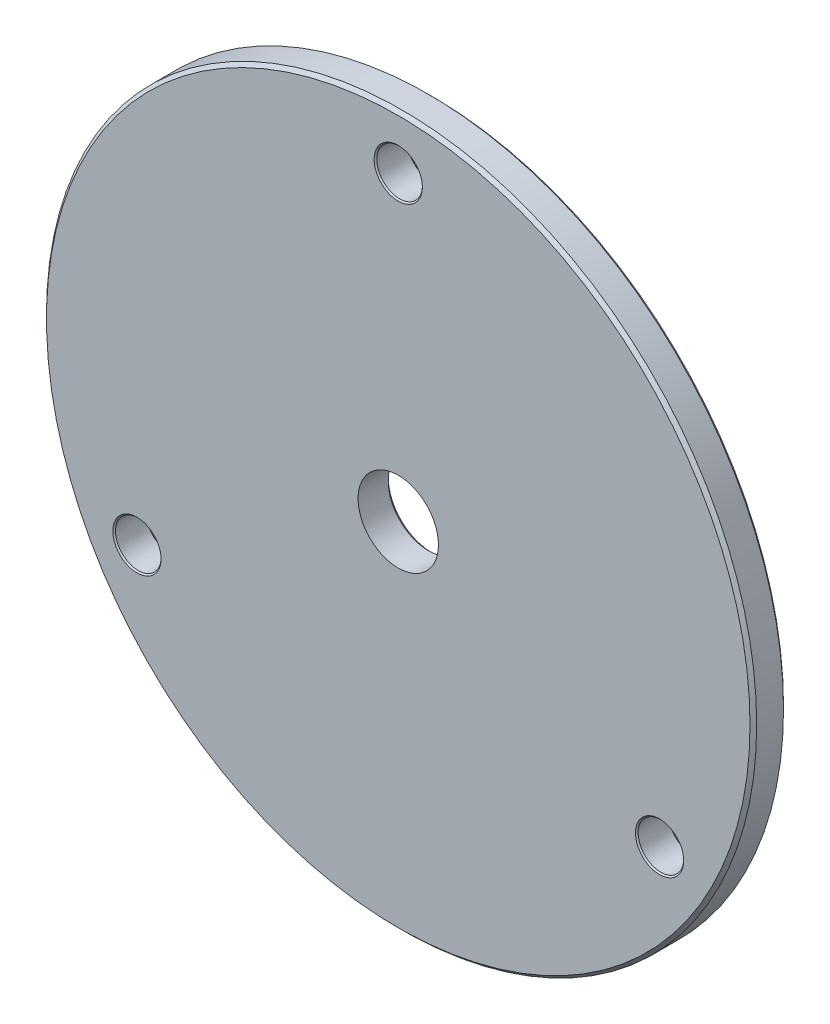
ISO-10303-21;
HEADER;
FILE_DESCRIPTION(('STEP AP214'),'2;1');
FILE_NAME('part.step','',(''),(''),'','','');
FILE_SCHEMA(('AUTOMOTIVE_DESIGN { 1 0 10303 214 1 1 1 1 }'));
ENDSEC;
DATA;
#1=APPLICATION_CONTEXT('core data for automotive mechanical design processes');
#2=APPLICATION_PROTOCOL_DEFINITION('international standard','automotive_design',2000,#1);
#3=PRODUCT_CONTEXT('',#1,'mechanical');
#4=PRODUCT('Part','Part','',(#3));
#5=PRODUCT_RELATED_PRODUCT_CATEGORY('part','',(#4));
#6=PRODUCT_DEFINITION_FORMATION('','',#4);
#7=PRODUCT_DEFINITION_CONTEXT('part definition',#1,'design');
#8=PRODUCT_DEFINITION('design','',#6,#7);
#9=PRODUCT_DEFINITION_SHAPE('','',#8);
#10=(LENGTH_UNIT() NAMED_UNIT(*) SI_UNIT(.MILLI.,.METRE.));
#11=(NAMED_UNIT(*) PLANE_ANGLE_UNIT() SI_UNIT($,.RADIAN.));
#12=(NAMED_UNIT(*) SI_UNIT($,.STERADIAN.) SOLID_ANGLE_UNIT());
#13=UNCERTAINTY_MEASURE_WITH_UNIT(LENGTH_MEASURE(1.E-05),#10,'distance_accuracy_value','');
#14=(GEOMETRIC_REPRESENTATION_CONTEXT(3) GLOBAL_UNCERTAINTY_ASSIGNED_CONTEXT((#13)) GLOBAL_UNIT_ASSIGNED_CONTEXT((#10,
#11,#12)) REPRESENTATION_CONTEXT('',''));
#15=CARTESIAN_POINT('',(0.,0.,0.));
#16=DIRECTION('',(0.,0.,1.));
#17=DIRECTION('',(1.,0.,0.));
#18=AXIS2_PLACEMENT_3D('',#15,#16,#17);
#19=CARTESIAN_POINT('',(0.,0.,5.));
#20=DIRECTION('',(0.,0.,-1.));
#21=DIRECTION('',(-1.,0.,0.));
#22=AXIS2_PLACEMENT_3D('',#19,#20,#21);
#23=CYLINDRICAL_SURFACE('',#22,53.);
#24=CARTESIAN_POINT('',(0.,0.,0.499999999999987));
#25=DIRECTION('',(0.,0.,1.));
#26=DIRECTION('',(1.,0.,0.));
#27=AXIS2_PLACEMENT_3D('',#24,#25,#26);
#28=CIRCLE('',#27,53.);
#29=CARTESIAN_POINT('',(53.,0.,0.499999999999987));
#30=VERTEX_POINT('',#29);
#31=EDGE_CURVE('E90',#30,#30,#28,.T.);
#32=ORIENTED_EDGE('',*,*,#31,.T.);
#33=EDGE_LOOP('',(#32));
#34=FACE_BOUND('',#33,.T.);
#35=CARTESIAN_POINT('',(0.,0.,4.50000000000003));
#36=DIRECTION('',(0.,0.,1.));
#37=DIRECTION('',(1.,0.,0.));
#38=AXIS2_PLACEMENT_3D('',#35,#36,#37);
#39=CIRCLE('',#38,53.);
#40=CARTESIAN_POINT('',(53.,0.,4.50000000000003));
#41=VERTEX_POINT('',#40);
#42=EDGE_CURVE('E93',#41,#41,#39,.F.);
#43=ORIENTED_EDGE('',*,*,#42,.T.);
#44=EDGE_LOOP('',(#43));
#45=FACE_BOUND('',#44,.T.);
#46=ADVANCED_FACE('F34',(#34,#45),#23,.T.);
#47=CARTESIAN_POINT('',(0.,0.,5.));
#48=DIRECTION('',(0.,0.,1.));
#49=DIRECTION('',(1.,0.,0.));
#50=AXIS2_PLACEMENT_3D('',#47,#48,#49);
#51=PLANE('',#50);
#52=CARTESIAN_POINT('',(0.,0.,5.));
#53=DIRECTION('',(0.,0.,1.));
#54=DIRECTION('',(1.,0.,0.));
#55=AXIS2_PLACEMENT_3D('',#52,#53,#54);
#56=CIRCLE('',#55,6.);
#57=CARTESIAN_POINT('',(6.,0.,5.));
#58=VERTEX_POINT('',#57);
#59=EDGE_CURVE('E96',#58,#58,#56,.T.);
#60=ORIENTED_EDGE('',*,*,#59,.F.);
#61=EDGE_LOOP('',(#60));
#62=FACE_BOUND('',#61,.T.);
#63=CARTESIAN_POINT('',(39.,-22.5166604983954,5.));
#64=DIRECTION('',(0.,0.,1.));
#65=DIRECTION('',(1.,0.,0.));
#66=AXIS2_PLACEMENT_3D('',#63,#64,#65);
#67=CIRCLE('',#66,3.60000000000002);
#68=CARTESIAN_POINT('',(42.6,-22.5166604983954,5.));
#69=VERTEX_POINT('',#68);
#70=EDGE_CURVE('E69',#69,#69,#67,.F.);
#71=ORIENTED_EDGE('',*,*,#70,.T.);
#72=EDGE_LOOP('',(#71));
#73=FACE_BOUND('',#72,.T.);
#74=CARTESIAN_POINT('',(-39.,-22.5166604983954,5.));
#75=DIRECTION('',(0.,0.,1.));
#76=DIRECTION('',(1.,0.,0.));
#77=AXIS2_PLACEMENT_3D('',#74,#75,#76);
#78=CIRCLE('',#77,3.59999999999999);
#79=CARTESIAN_POINT('',(-35.4,-22.5166604983954,5.));
#80=VERTEX_POINT('',#79);
#81=EDGE_CURVE('E72',#80,#80,#78,.F.);
#82=ORIENTED_EDGE('',*,*,#81,.T.);
#83=EDGE_LOOP('',(#82));
#84=FACE_BOUND('',#83,.T.);
#85=CARTESIAN_POINT('',(0.,45.0333209967908,5.));
#86=DIRECTION('',(0.,0.,1.));
#87=DIRECTION('',(1.,0.,0.));
#88=AXIS2_PLACEMENT_3D('',#85,#86,#87);
#89=CIRCLE('',#88,3.59999999999999);
#90=CARTESIAN_POINT('',(3.59999999999999,45.0333209967908,5.));
#91=VERTEX_POINT('',#90);
#92=EDGE_CURVE('E75',#91,#91,#89,.F.);
#93=ORIENTED_EDGE('',*,*,#92,.T.);
#94=EDGE_LOOP('',(#93));
#95=FACE_BOUND('',#94,.T.);
#96=CARTESIAN_POINT('',(0.,0.,5.));
#97=DIRECTION('',(0.,0.,1.));
#98=DIRECTION('',(1.,0.,0.));
#99=AXIS2_PLACEMENT_3D('',#96,#97,#98);
#100=CIRCLE('',#99,52.5);
#101=CARTESIAN_POINT('',(52.5,0.,5.));
#102=VERTEX_POINT('',#101);
#103=EDGE_CURVE('E84',#102,#102,#100,.T.);
#104=ORIENTED_EDGE('',*,*,#103,.T.);
#105=EDGE_LOOP('',(#104));
#106=FACE_BOUND('',#105,.T.);
#107=ADVANCED_FACE('F102',(#62,#73,#84,#95,#106),#51,.T.);
#108=CARTESIAN_POINT('',(0.,0.,0.));
#109=DIRECTION('',(0.,0.,1.));
#110=DIRECTION('',(1.,0.,0.));
#111=AXIS2_PLACEMENT_3D('',#108,#109,#110);
#112=PLANE('',#111);
#113=CARTESIAN_POINT('',(0.,0.,0.));
#114=DIRECTION('',(0.,0.,1.));
#115=DIRECTION('',(1.,0.,0.));
#116=AXIS2_PLACEMENT_3D('',#113,#114,#115);
#117=CIRCLE('',#116,6.49999999999998);
#118=CARTESIAN_POINT('',(6.49999999999998,0.,0.));
#119=VERTEX_POINT('',#118);
#120=EDGE_CURVE('E41',#119,#119,#117,.T.);
#121=ORIENTED_EDGE('',*,*,#120,.T.);
#122=EDGE_LOOP('',(#121));
#123=FACE_BOUND('',#122,.T.);
#124=CARTESIAN_POINT('',(39.,-22.5166604983954,0.));
#125=DIRECTION('',(0.,0.,1.));
#126=DIRECTION('',(1.,0.,0.));
#127=AXIS2_PLACEMENT_3D('',#124,#125,#126);
#128=CIRCLE('',#127,3.59999999999998);
#129=CARTESIAN_POINT('',(42.6,-22.5166604983954,0.));
#130=VERTEX_POINT('',#129);
#131=EDGE_CURVE('E60',#130,#130,#128,.T.);
#132=ORIENTED_EDGE('',*,*,#131,.T.);
#133=EDGE_LOOP('',(#132));
#134=FACE_BOUND('',#133,.T.);
#135=CARTESIAN_POINT('',(-39.,-22.5166604983954,0.));
#136=DIRECTION('',(0.,0.,1.));
#137=DIRECTION('',(1.,0.,0.));
#138=AXIS2_PLACEMENT_3D('',#135,#136,#137);
#139=CIRCLE('',#138,3.60000000000005);
#140=CARTESIAN_POINT('',(-35.4,-22.5166604983954,0.));
#141=VERTEX_POINT('',#140);
#142=EDGE_CURVE('E63',#141,#141,#139,.T.);
#143=ORIENTED_EDGE('',*,*,#142,.T.);
#144=EDGE_LOOP('',(#143));
#145=FACE_BOUND('',#144,.T.);
#146=CARTESIAN_POINT('',(0.,45.0333209967908,0.));
#147=DIRECTION('',(0.,0.,1.));
#148=DIRECTION('',(1.,0.,0.));
#149=AXIS2_PLACEMENT_3D('',#146,#147,#148);
#150=CIRCLE('',#149,3.60000000000001);
#151=CARTESIAN_POINT('',(3.60000000000001,45.0333209967908,0.));
#152=VERTEX_POINT('',#151);
#153=EDGE_CURVE('E66',#152,#152,#150,.T.);
#154=ORIENTED_EDGE('',*,*,#153,.T.);
#155=EDGE_LOOP('',(#154));
#156=FACE_BOUND('',#155,.T.);
#157=CARTESIAN_POINT('',(0.,0.,0.));
#158=DIRECTION('',(0.,0.,1.));
#159=DIRECTION('',(1.,0.,0.));
#160=AXIS2_PLACEMENT_3D('',#157,#158,#159);
#161=CIRCLE('',#160,52.5);
#162=CARTESIAN_POINT('',(52.5,0.,0.));
#163=VERTEX_POINT('',#162);
#164=EDGE_CURVE('E87',#163,#163,#161,.F.);
#165=ORIENTED_EDGE('',*,*,#164,.T.);
#166=EDGE_LOOP('',(#165));
#167=FACE_BOUND('',#166,.T.);
#168=ADVANCED_FACE('F105',(#123,#134,#145,#156,#167),#112,.F.);
#169=CARTESIAN_POINT('',(0.,0.,0.499999999999987));
#170=DIRECTION('',(0.,0.,1.));
#171=DIRECTION('',(1.,0.,0.));
#172=AXIS2_PLACEMENT_3D('',#169,#170,#171);
#173=CONICAL_SURFACE('',#172,53.,0.785398163397455);
#174=ORIENTED_EDGE('',*,*,#164,.F.);
#175=EDGE_LOOP('',(#174));
#176=FACE_BOUND('',#175,.T.);
#177=ORIENTED_EDGE('',*,*,#31,.F.);
#178=EDGE_LOOP('',(#177));
#179=FACE_BOUND('',#178,.T.);
#180=ADVANCED_FACE('F118',(#176,#179),#173,.T.);
#181=CARTESIAN_POINT('',(0.,0.,5.));
#182=DIRECTION('',(0.,0.,-1.));
#183=DIRECTION('',(-1.,0.,0.));
#184=AXIS2_PLACEMENT_3D('',#181,#182,#183);
#185=CONICAL_SURFACE('',#184,52.5,0.785398163397462);
#186=ORIENTED_EDGE('',*,*,#42,.F.);
#187=EDGE_LOOP('',(#186));
#188=FACE_BOUND('',#187,.T.);
#189=ORIENTED_EDGE('',*,*,#103,.F.);
#190=EDGE_LOOP('',(#189));
#191=FACE_BOUND('',#190,.T.);
#192=ADVANCED_FACE('F115',(#188,#191),#185,.T.);
#193=CARTESIAN_POINT('',(-39.,-22.5166604983954,5.));
#194=DIRECTION('',(0.,0.,1.));
#195=DIRECTION('',(1.,0.,0.));
#196=AXIS2_PLACEMENT_3D('',#193,#194,#195);
#197=CYLINDRICAL_SURFACE('',#196,3.4);
#198=CARTESIAN_POINT('',(-39.,-22.5166604983954,4.80000000000002));
#199=DIRECTION('',(0.,0.,1.));
#200=DIRECTION('',(1.,0.,0.));
#201=AXIS2_PLACEMENT_3D('',#198,#199,#200);
#202=CIRCLE('',#201,3.4);
#203=CARTESIAN_POINT('',(-35.6,-22.5166604983954,4.80000000000002));
#204=VERTEX_POINT('',#203);
#205=EDGE_CURVE('E54',#204,#204,#202,.T.);
#206=ORIENTED_EDGE('',*,*,#205,.T.);
#207=EDGE_LOOP('',(#206));
#208=FACE_BOUND('',#207,.T.);
#209=CARTESIAN_POINT('',(-39.,-22.5166604983954,0.200000000000031));
#210=DIRECTION('',(0.,0.,1.));
#211=DIRECTION('',(1.,0.,0.));
#212=AXIS2_PLACEMENT_3D('',#209,#210,#211);
#213=CIRCLE('',#212,3.4);
#214=CARTESIAN_POINT('',(-35.6,-22.5166604983954,0.200000000000031));
#215=VERTEX_POINT('',#214);
#216=EDGE_CURVE('E57',#215,#215,#213,.F.);
#217=ORIENTED_EDGE('',*,*,#216,.T.);
#218=EDGE_LOOP('',(#217));
#219=FACE_BOUND('',#218,.T.);
#220=ADVANCED_FACE('F117',(#208,#219),#197,.F.);
#221=CARTESIAN_POINT('',(39.,-22.5166604983954,5.));
#222=DIRECTION('',(0.,0.,1.));
#223=DIRECTION('',(1.,0.,0.));
#224=AXIS2_PLACEMENT_3D('',#221,#222,#223);
#225=CYLINDRICAL_SURFACE('',#224,3.4);
#226=CARTESIAN_POINT('',(39.,-22.5166604983954,4.79999999999998));
#227=DIRECTION('',(0.,0.,1.));
#228=DIRECTION('',(1.,0.,0.));
#229=AXIS2_PLACEMENT_3D('',#226,#227,#228);
#230=CIRCLE('',#229,3.4);
#231=CARTESIAN_POINT('',(42.4,-22.5166604983954,4.79999999999998));
#232=VERTEX_POINT('',#231);
#233=EDGE_CURVE('E78',#232,#232,#230,.T.);
#234=ORIENTED_EDGE('',*,*,#233,.T.);
#235=EDGE_LOOP('',(#234));
#236=FACE_BOUND('',#235,.T.);
#237=CARTESIAN_POINT('',(39.,-22.5166604983954,0.199999999999975));
#238=DIRECTION('',(0.,0.,1.));
#239=DIRECTION('',(1.,0.,0.));
#240=AXIS2_PLACEMENT_3D('',#237,#238,#239);
#241=CIRCLE('',#240,3.4);
#242=CARTESIAN_POINT('',(42.4,-22.5166604983954,0.199999999999975));
#243=VERTEX_POINT('',#242);
#244=EDGE_CURVE('E81',#243,#243,#241,.F.);
#245=ORIENTED_EDGE('',*,*,#244,.T.);
#246=EDGE_LOOP('',(#245));
#247=FACE_BOUND('',#246,.T.);
#248=ADVANCED_FACE('F125',(#236,#247),#225,.F.);
#249=CARTESIAN_POINT('',(0.,45.0333209967908,5.));
#250=DIRECTION('',(0.,0.,1.));
#251=DIRECTION('',(1.,0.,0.));
#252=AXIS2_PLACEMENT_3D('',#249,#250,#251);
#253=CYLINDRICAL_SURFACE('',#252,3.4);
#254=CARTESIAN_POINT('',(0.,45.0333209967908,4.80000000000001));
#255=DIRECTION('',(0.,0.,1.));
#256=DIRECTION('',(1.,0.,0.));
#257=AXIS2_PLACEMENT_3D('',#254,#255,#256);
#258=CIRCLE('',#257,3.4);
#259=CARTESIAN_POINT('',(3.4,45.0333209967908,4.80000000000001));
#260=VERTEX_POINT('',#259);
#261=EDGE_CURVE('E45',#260,#260,#258,.T.);
#262=ORIENTED_EDGE('',*,*,#261,.T.);
#263=EDGE_LOOP('',(#262));
#264=FACE_BOUND('',#263,.T.);
#265=CARTESIAN_POINT('',(0.,45.0333209967908,0.200000000000017));
#266=DIRECTION('',(0.,0.,1.));
#267=DIRECTION('',(1.,0.,0.));
#268=AXIS2_PLACEMENT_3D('',#265,#266,#267);
#269=CIRCLE('',#268,3.4);
#270=CARTESIAN_POINT('',(3.4,45.0333209967908,0.200000000000017));
#271=VERTEX_POINT('',#270);
#272=EDGE_CURVE('E49',#271,#271,#269,.F.);
#273=ORIENTED_EDGE('',*,*,#272,.T.);
#274=EDGE_LOOP('',(#273));
#275=FACE_BOUND('',#274,.T.);
#276=ADVANCED_FACE('F143',(#264,#275),#253,.F.);
#277=CARTESIAN_POINT('',(39.,-22.5166604983954,4.79999999999998));
#278=DIRECTION('',(0.,0.,1.));
#279=DIRECTION('',(1.,0.,0.));
#280=AXIS2_PLACEMENT_3D('',#277,#278,#279);
#281=CONICAL_SURFACE('',#280,3.4,0.785398163397453);
#282=ORIENTED_EDGE('',*,*,#70,.F.);
#283=EDGE_LOOP('',(#282));
#284=FACE_BOUND('',#283,.T.);
#285=ORIENTED_EDGE('',*,*,#233,.F.);
#286=EDGE_LOOP('',(#285));
#287=FACE_BOUND('',#286,.T.);
#288=ADVANCED_FACE('F147',(#284,#287),#281,.F.);
#289=CARTESIAN_POINT('',(39.,-22.5166604983954,0.));
#290=DIRECTION('',(0.,0.,-1.));
#291=DIRECTION('',(-1.,0.,0.));
#292=AXIS2_PLACEMENT_3D('',#289,#290,#291);
#293=CONICAL_SURFACE('',#292,3.59999999999998,0.785398163397455);
#294=ORIENTED_EDGE('',*,*,#244,.F.);
#295=EDGE_LOOP('',(#294));
#296=FACE_BOUND('',#295,.T.);
#297=ORIENTED_EDGE('',*,*,#131,.F.);
#298=EDGE_LOOP('',(#297));
#299=FACE_BOUND('',#298,.T.);
#300=ADVANCED_FACE('F173',(#296,#299),#293,.F.);
#301=CARTESIAN_POINT('',(-39.,-22.5166604983954,4.80000000000002));
#302=DIRECTION('',(0.,0.,1.));
#303=DIRECTION('',(1.,0.,0.));
#304=AXIS2_PLACEMENT_3D('',#301,#302,#303);
#305=CONICAL_SURFACE('',#304,3.4,0.785398163397474);
#306=ORIENTED_EDGE('',*,*,#81,.F.);
#307=EDGE_LOOP('',(#306));
#308=FACE_BOUND('',#307,.T.);
#309=ORIENTED_EDGE('',*,*,#205,.F.);
#310=EDGE_LOOP('',(#309));
#311=FACE_BOUND('',#310,.T.);
#312=ADVANCED_FACE('F169',(#308,#311),#305,.F.);
#313=CARTESIAN_POINT('',(-39.,-22.5166604983954,0.));
#314=DIRECTION('',(0.,0.,-1.));
#315=DIRECTION('',(-1.,0.,0.));
#316=AXIS2_PLACEMENT_3D('',#313,#314,#315);
#317=CONICAL_SURFACE('',#316,3.60000000000005,0.785398163397489);
#318=ORIENTED_EDGE('',*,*,#216,.F.);
#319=EDGE_LOOP('',(#318));
#320=FACE_BOUND('',#319,.T.);
#321=ORIENTED_EDGE('',*,*,#142,.F.);
#322=EDGE_LOOP('',(#321));
#323=FACE_BOUND('',#322,.T.);
#324=ADVANCED_FACE('F161',(#320,#323),#317,.F.);
#325=CARTESIAN_POINT('',(0.,45.0333209967908,4.80000000000001));
#326=DIRECTION('',(0.,0.,1.));
#327=DIRECTION('',(1.,0.,0.));
#328=AXIS2_PLACEMENT_3D('',#325,#326,#327);
#329=CONICAL_SURFACE('',#328,3.4,0.78539816339747);
#330=ORIENTED_EDGE('',*,*,#92,.F.);
#331=EDGE_LOOP('',(#330));
#332=FACE_BOUND('',#331,.T.);
#333=ORIENTED_EDGE('',*,*,#261,.F.);
#334=EDGE_LOOP('',(#333));
#335=FACE_BOUND('',#334,.T.);
#336=ADVANCED_FACE('F156',(#332,#335),#329,.F.);
#337=CARTESIAN_POINT('',(0.,45.0333209967908,0.));
#338=DIRECTION('',(0.,0.,-1.));
#339=DIRECTION('',(-1.,0.,0.));
#340=AXIS2_PLACEMENT_3D('',#337,#338,#339);
#341=CONICAL_SURFACE('',#340,3.60000000000001,0.785398163397426);
#342=ORIENTED_EDGE('',*,*,#272,.F.);
#343=EDGE_LOOP('',(#342));
#344=FACE_BOUND('',#343,.T.);
#345=ORIENTED_EDGE('',*,*,#153,.F.);
#346=EDGE_LOOP('',(#345));
#347=FACE_BOUND('',#346,.T.);
#348=ADVANCED_FACE('F150',(#344,#347),#341,.F.);
#349=CARTESIAN_POINT('',(0.,0.,0.));
#350=DIRECTION('',(0.,0.,1.));
#351=DIRECTION('',(1.,0.,0.));
#352=AXIS2_PLACEMENT_3D('',#349,#350,#351);
#353=CYLINDRICAL_SURFACE('',#352,6.);
#354=CARTESIAN_POINT('',(0.,0.,0.499999999999983));
#355=DIRECTION('',(0.,0.,1.));
#356=DIRECTION('',(1.,0.,0.));
#357=AXIS2_PLACEMENT_3D('',#354,#355,#356);
#358=CIRCLE('',#357,6.);
#359=CARTESIAN_POINT('',(6.,0.,0.499999999999983));
#360=VERTEX_POINT('',#359);
#361=EDGE_CURVE('E10',#360,#360,#358,.F.);
#362=ORIENTED_EDGE('',*,*,#361,.T.);
#363=EDGE_LOOP('',(#362));
#364=FACE_BOUND('',#363,.T.);
#365=ORIENTED_EDGE('',*,*,#59,.T.);
#366=EDGE_LOOP('',(#365));
#367=FACE_BOUND('',#366,.T.);
#368=ADVANCED_FACE('F100',(#364,#367),#353,.F.);
#369=CARTESIAN_POINT('',(0.,0.,0.));
#370=DIRECTION('',(0.,0.,-1.));
#371=DIRECTION('',(-1.,0.,0.));
#372=AXIS2_PLACEMENT_3D('',#369,#370,#371);
#373=CONICAL_SURFACE('',#372,6.49999999999998,0.785398163397442);
#374=ORIENTED_EDGE('',*,*,#361,.F.);
#375=EDGE_LOOP('',(#374));
#376=FACE_BOUND('',#375,.T.);
#377=ORIENTED_EDGE('',*,*,#120,.F.);
#378=EDGE_LOOP('',(#377));
#379=FACE_BOUND('',#378,.T.);
#380=ADVANCED_FACE('F36',(#376,#379),#373,.F.);
#381=CLOSED_SHELL('',(#46,#107,#168,#180,#192,#220,#248,#276,#288,#300,#312,#324,#336,#348,#368,#380));
#382=MANIFOLD_SOLID_BREP('B2',#381);
#383=ADVANCED_BREP_SHAPE_REPRESENTATION('',(#18,#382),#14);
#384=SHAPE_DEFINITION_REPRESENTATION(#9,#383);
ENDSEC;
END-ISO-10303-21;
